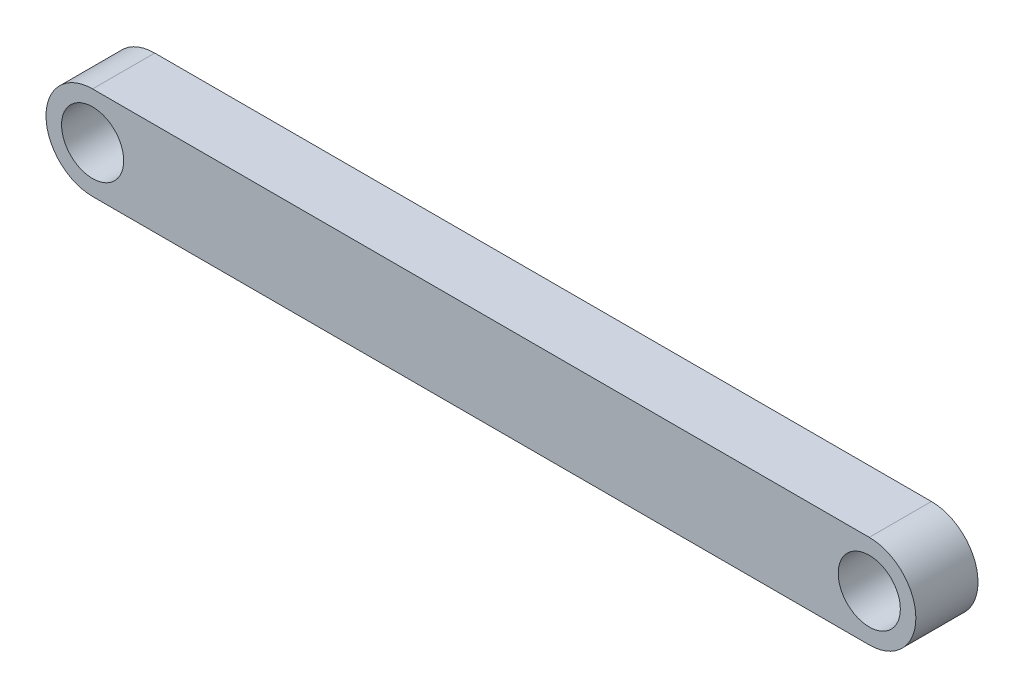
ISO-10303-21;
HEADER;
FILE_DESCRIPTION(('STEP AP214'),'2;1');
FILE_NAME('part.step','',(''),(''),'','','');
FILE_SCHEMA(('AUTOMOTIVE_DESIGN { 1 0 10303 214 1 1 1 1 }'));
ENDSEC;
DATA;
#1=APPLICATION_CONTEXT('core data for automotive mechanical design processes');
#2=APPLICATION_PROTOCOL_DEFINITION('international standard','automotive_design',2000,#1);
#3=PRODUCT_CONTEXT('',#1,'mechanical');
#4=PRODUCT('Part','Part','',(#3));
#5=PRODUCT_RELATED_PRODUCT_CATEGORY('part','',(#4));
#6=PRODUCT_DEFINITION_FORMATION('','',#4);
#7=PRODUCT_DEFINITION_CONTEXT('part definition',#1,'design');
#8=PRODUCT_DEFINITION('design','',#6,#7);
#9=PRODUCT_DEFINITION_SHAPE('','',#8);
#10=(LENGTH_UNIT() NAMED_UNIT(*) SI_UNIT(.MILLI.,.METRE.));
#11=(NAMED_UNIT(*) PLANE_ANGLE_UNIT() SI_UNIT($,.RADIAN.));
#12=(NAMED_UNIT(*) SI_UNIT($,.STERADIAN.) SOLID_ANGLE_UNIT());
#13=UNCERTAINTY_MEASURE_WITH_UNIT(LENGTH_MEASURE(1.E-05),#10,'distance_accuracy_value','');
#14=(GEOMETRIC_REPRESENTATION_CONTEXT(3) GLOBAL_UNCERTAINTY_ASSIGNED_CONTEXT((#13)) GLOBAL_UNIT_ASSIGNED_CONTEXT((#10,
#11,#12)) REPRESENTATION_CONTEXT('',''));
#15=CARTESIAN_POINT('',(0.,0.,0.));
#16=DIRECTION('',(0.,0.,1.));
#17=DIRECTION('',(1.,0.,0.));
#18=AXIS2_PLACEMENT_3D('',#15,#16,#17);
#19=CARTESIAN_POINT('',(-75.,0.,20.));
#20=DIRECTION('',(0.,0.,1.));
#21=DIRECTION('',(1.,0.,0.));
#22=AXIS2_PLACEMENT_3D('',#19,#20,#21);
#23=PLANE('',#22);
#24=CARTESIAN_POINT('',(-75.,0.,20.));
#25=DIRECTION('',(0.,0.,1.));
#26=DIRECTION('',(1.,0.,0.));
#27=AXIS2_PLACEMENT_3D('',#24,#25,#26);
#28=CIRCLE('',#27,10.);
#29=CARTESIAN_POINT('',(-64.9999999999999,0.,20.));
#30=VERTEX_POINT('',#29);
#31=EDGE_CURVE('E111',#30,#30,#28,.T.);
#32=ORIENTED_EDGE('',*,*,#31,.F.);
#33=EDGE_LOOP('',(#32));
#34=FACE_BOUND('',#33,.T.);
#35=CARTESIAN_POINT('',(-75.,0.,20.));
#36=DIRECTION('',(0.,0.,1.));
#37=DIRECTION('',(1.,0.,0.));
#38=AXIS2_PLACEMENT_3D('',#35,#36,#37);
#39=CIRCLE('',#38,15.);
#40=CARTESIAN_POINT('',(-74.9999999999998,-15.0000000000001,20.));
#41=VERTEX_POINT('',#40);
#42=CARTESIAN_POINT('',(-74.9999999999998,14.9999999999999,20.));
#43=VERTEX_POINT('',#42);
#44=EDGE_CURVE('E90',#41,#43,#39,.T.);
#45=ORIENTED_EDGE('',*,*,#44,.T.);
#46=DIRECTION('',(-1.,0.,0.));
#47=VECTOR('',#46,1.);
#48=CARTESIAN_POINT('',(-74.9999999999998,14.9999999999999,20.));
#49=LINE('',#48,#47);
#50=CARTESIAN_POINT('',(-325.,15.,20.));
#51=VERTEX_POINT('',#50);
#52=EDGE_CURVE('E85',#43,#51,#49,.T.);
#53=ORIENTED_EDGE('',*,*,#52,.T.);
#54=CARTESIAN_POINT('',(-325.000000000001,-1.38777878078145E-13,20.));
#55=DIRECTION('',(0.,0.,1.));
#56=DIRECTION('',(1.,0.,0.));
#57=AXIS2_PLACEMENT_3D('',#54,#55,#56);
#58=CIRCLE('',#57,15.);
#59=CARTESIAN_POINT('',(-325.,-14.9999999999999,20.));
#60=VERTEX_POINT('',#59);
#61=EDGE_CURVE('E88',#51,#60,#58,.T.);
#62=ORIENTED_EDGE('',*,*,#61,.T.);
#63=DIRECTION('',(1.,0.,0.));
#64=VECTOR('',#63,1.);
#65=CARTESIAN_POINT('',(-74.9999999999998,-15.0000000000001,20.));
#66=LINE('',#65,#64);
#67=EDGE_CURVE('E55',#60,#41,#66,.T.);
#68=ORIENTED_EDGE('',*,*,#67,.T.);
#69=EDGE_LOOP('',(#45,#53,#62,#68));
#70=FACE_BOUND('',#69,.T.);
#71=CARTESIAN_POINT('',(-325.000000000001,-1.38777878078145E-13,20.));
#72=DIRECTION('',(0.,0.,1.));
#73=DIRECTION('',(1.,0.,0.));
#74=AXIS2_PLACEMENT_3D('',#71,#72,#73);
#75=CIRCLE('',#74,9.99999999999998);
#76=CARTESIAN_POINT('',(-315.000000000001,-1.33781874467331E-13,20.));
#77=VERTEX_POINT('',#76);
#78=EDGE_CURVE('E136',#77,#77,#75,.T.);
#79=ORIENTED_EDGE('',*,*,#78,.F.);
#80=EDGE_LOOP('',(#79));
#81=FACE_BOUND('',#80,.T.);
#82=ADVANCED_FACE('F37',(#34,#70,#81),#23,.T.);
#83=CARTESIAN_POINT('',(-75.,0.,0.));
#84=DIRECTION('',(0.,0.,1.));
#85=DIRECTION('',(1.,0.,0.));
#86=AXIS2_PLACEMENT_3D('',#83,#84,#85);
#87=PLANE('',#86);
#88=CARTESIAN_POINT('',(-75.,0.,0.));
#89=DIRECTION('',(0.,0.,1.));
#90=DIRECTION('',(1.,0.,0.));
#91=AXIS2_PLACEMENT_3D('',#88,#89,#90);
#92=CIRCLE('',#91,15.);
#93=CARTESIAN_POINT('',(-74.9999999999998,-15.0000000000001,0.));
#94=VERTEX_POINT('',#93);
#95=CARTESIAN_POINT('',(-74.9999999999998,14.9999999999999,0.));
#96=VERTEX_POINT('',#95);
#97=EDGE_CURVE('E107',#94,#96,#92,.T.);
#98=ORIENTED_EDGE('',*,*,#97,.F.);
#99=DIRECTION('',(1.,0.,0.));
#100=VECTOR('',#99,1.);
#101=CARTESIAN_POINT('',(-74.9999999999998,-15.0000000000001,0.));
#102=LINE('',#101,#100);
#103=CARTESIAN_POINT('',(-325.,-14.9999999999999,0.));
#104=VERTEX_POINT('',#103);
#105=EDGE_CURVE('E78',#104,#94,#102,.T.);
#106=ORIENTED_EDGE('',*,*,#105,.F.);
#107=CARTESIAN_POINT('',(-325.000000000001,-1.38777878078145E-13,0.));
#108=DIRECTION('',(0.,0.,1.));
#109=DIRECTION('',(1.,0.,0.));
#110=AXIS2_PLACEMENT_3D('',#107,#108,#109);
#111=CIRCLE('',#110,15.);
#112=CARTESIAN_POINT('',(-325.,15.,0.));
#113=VERTEX_POINT('',#112);
#114=EDGE_CURVE('E72',#113,#104,#111,.T.);
#115=ORIENTED_EDGE('',*,*,#114,.F.);
#116=DIRECTION('',(-1.,0.,0.));
#117=VECTOR('',#116,1.);
#118=CARTESIAN_POINT('',(-74.9999999999998,14.9999999999999,0.));
#119=LINE('',#118,#117);
#120=EDGE_CURVE('E95',#96,#113,#119,.T.);
#121=ORIENTED_EDGE('',*,*,#120,.F.);
#122=EDGE_LOOP('',(#98,#106,#115,#121));
#123=FACE_BOUND('',#122,.T.);
#124=CARTESIAN_POINT('',(-75.,0.,0.));
#125=DIRECTION('',(0.,0.,1.));
#126=DIRECTION('',(1.,0.,0.));
#127=AXIS2_PLACEMENT_3D('',#124,#125,#126);
#128=CIRCLE('',#127,10.);
#129=CARTESIAN_POINT('',(-64.9999999999999,0.,0.));
#130=VERTEX_POINT('',#129);
#131=EDGE_CURVE('E132',#130,#130,#128,.T.);
#132=ORIENTED_EDGE('',*,*,#131,.T.);
#133=EDGE_LOOP('',(#132));
#134=FACE_BOUND('',#133,.T.);
#135=CARTESIAN_POINT('',(-325.000000000001,-1.38777878078145E-13,0.));
#136=DIRECTION('',(0.,0.,1.));
#137=DIRECTION('',(1.,0.,0.));
#138=AXIS2_PLACEMENT_3D('',#135,#136,#137);
#139=CIRCLE('',#138,9.99999999999998);
#140=CARTESIAN_POINT('',(-315.000000000001,-1.33781874467331E-13,0.));
#141=VERTEX_POINT('',#140);
#142=EDGE_CURVE('E139',#141,#141,#139,.T.);
#143=ORIENTED_EDGE('',*,*,#142,.T.);
#144=EDGE_LOOP('',(#143));
#145=FACE_BOUND('',#144,.T.);
#146=ADVANCED_FACE('F125',(#123,#134,#145),#87,.F.);
#147=CARTESIAN_POINT('',(-75.,0.,20.));
#148=DIRECTION('',(0.,0.,-1.));
#149=DIRECTION('',(-1.,0.,0.));
#150=AXIS2_PLACEMENT_3D('',#147,#148,#149);
#151=CYLINDRICAL_SURFACE('',#150,15.);
#152=ORIENTED_EDGE('',*,*,#97,.T.);
#153=DIRECTION('',(0.,0.,-1.));
#154=VECTOR('',#153,1.);
#155=CARTESIAN_POINT('',(-74.9999999999998,14.9999999999999,20.));
#156=LINE('',#155,#154);
#157=EDGE_CURVE('E11',#43,#96,#156,.T.);
#158=ORIENTED_EDGE('',*,*,#157,.F.);
#159=ORIENTED_EDGE('',*,*,#44,.F.);
#160=DIRECTION('',(0.,0.,-1.));
#161=VECTOR('',#160,1.);
#162=CARTESIAN_POINT('',(-74.9999999999998,-15.0000000000001,20.));
#163=LINE('',#162,#161);
#164=EDGE_CURVE('E103',#41,#94,#163,.T.);
#165=ORIENTED_EDGE('',*,*,#164,.T.);
#166=EDGE_LOOP('',(#152,#158,#159,#165));
#167=FACE_BOUND('',#166,.T.);
#168=ADVANCED_FACE('F39',(#167),#151,.T.);
#169=CARTESIAN_POINT('',(-74.9999999999998,14.9999999999999,20.));
#170=DIRECTION('',(0.,-1.,0.));
#171=DIRECTION('',(1.,0.,0.));
#172=AXIS2_PLACEMENT_3D('',#169,#170,#171);
#173=PLANE('',#172);
#174=ORIENTED_EDGE('',*,*,#120,.T.);
#175=DIRECTION('',(0.,0.,-1.));
#176=VECTOR('',#175,1.);
#177=CARTESIAN_POINT('',(-325.,15.,20.));
#178=LINE('',#177,#176);
#179=EDGE_CURVE('E47',#51,#113,#178,.T.);
#180=ORIENTED_EDGE('',*,*,#179,.F.);
#181=ORIENTED_EDGE('',*,*,#52,.F.);
#182=ORIENTED_EDGE('',*,*,#157,.T.);
#183=EDGE_LOOP('',(#174,#180,#181,#182));
#184=FACE_BOUND('',#183,.T.);
#185=ADVANCED_FACE('F94',(#184),#173,.F.);
#186=CARTESIAN_POINT('',(-325.000000000001,-1.38777878078145E-13,20.));
#187=DIRECTION('',(0.,0.,-1.));
#188=DIRECTION('',(-1.,0.,0.));
#189=AXIS2_PLACEMENT_3D('',#186,#187,#188);
#190=CYLINDRICAL_SURFACE('',#189,15.);
#191=ORIENTED_EDGE('',*,*,#114,.T.);
#192=DIRECTION('',(0.,0.,-1.));
#193=VECTOR('',#192,1.);
#194=CARTESIAN_POINT('',(-325.,-14.9999999999999,20.));
#195=LINE('',#194,#193);
#196=EDGE_CURVE('E97',#60,#104,#195,.T.);
#197=ORIENTED_EDGE('',*,*,#196,.F.);
#198=ORIENTED_EDGE('',*,*,#61,.F.);
#199=ORIENTED_EDGE('',*,*,#179,.T.);
#200=EDGE_LOOP('',(#191,#197,#198,#199));
#201=FACE_BOUND('',#200,.T.);
#202=ADVANCED_FACE('F98',(#201),#190,.T.);
#203=CARTESIAN_POINT('',(-74.9999999999998,-15.0000000000001,20.));
#204=DIRECTION('',(0.,1.,0.));
#205=DIRECTION('',(-1.,0.,0.));
#206=AXIS2_PLACEMENT_3D('',#203,#204,#205);
#207=PLANE('',#206);
#208=ORIENTED_EDGE('',*,*,#105,.T.);
#209=ORIENTED_EDGE('',*,*,#164,.F.);
#210=ORIENTED_EDGE('',*,*,#67,.F.);
#211=ORIENTED_EDGE('',*,*,#196,.T.);
#212=EDGE_LOOP('',(#208,#209,#210,#211));
#213=FACE_BOUND('',#212,.T.);
#214=ADVANCED_FACE('F122',(#213),#207,.F.);
#215=CARTESIAN_POINT('',(-75.,0.,20.));
#216=DIRECTION('',(0.,0.,-1.));
#217=DIRECTION('',(-1.,0.,0.));
#218=AXIS2_PLACEMENT_3D('',#215,#216,#217);
#219=CYLINDRICAL_SURFACE('',#218,10.);
#220=ORIENTED_EDGE('',*,*,#31,.T.);
#221=EDGE_LOOP('',(#220));
#222=FACE_BOUND('',#221,.T.);
#223=ORIENTED_EDGE('',*,*,#131,.F.);
#224=EDGE_LOOP('',(#223));
#225=FACE_BOUND('',#224,.T.);
#226=ADVANCED_FACE('F159',(#222,#225),#219,.F.);
#227=CARTESIAN_POINT('',(-325.000000000001,-1.38777878078145E-13,20.));
#228=DIRECTION('',(0.,0.,-1.));
#229=DIRECTION('',(-1.,0.,0.));
#230=AXIS2_PLACEMENT_3D('',#227,#228,#229);
#231=CYLINDRICAL_SURFACE('',#230,9.99999999999998);
#232=ORIENTED_EDGE('',*,*,#78,.T.);
#233=EDGE_LOOP('',(#232));
#234=FACE_BOUND('',#233,.T.);
#235=ORIENTED_EDGE('',*,*,#142,.F.);
#236=EDGE_LOOP('',(#235));
#237=FACE_BOUND('',#236,.T.);
#238=ADVANCED_FACE('F148',(#234,#237),#231,.F.);
#239=CLOSED_SHELL('',(#82,#146,#168,#185,#202,#214,#226,#238));
#240=MANIFOLD_SOLID_BREP('B2',#239);
#241=ADVANCED_BREP_SHAPE_REPRESENTATION('',(#18,#240),#14);
#242=SHAPE_DEFINITION_REPRESENTATION(#9,#241);
ENDSEC;
END-ISO-10303-21;
